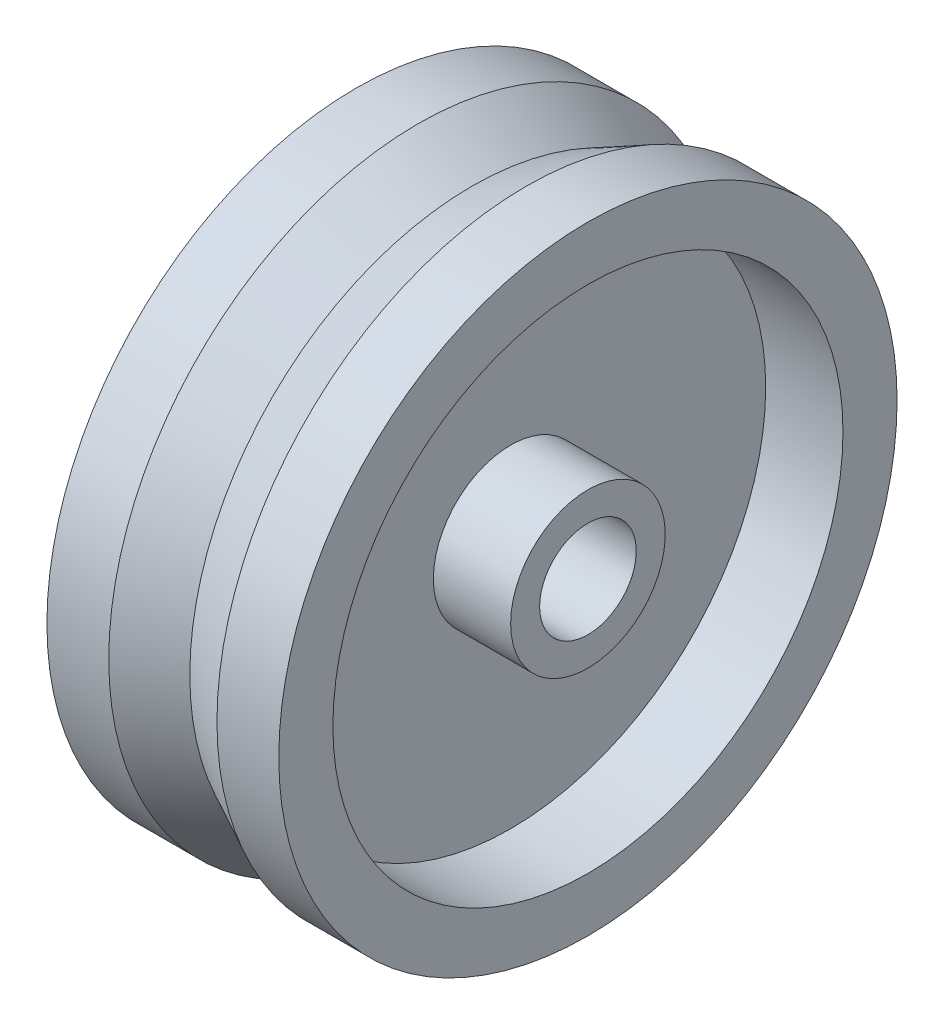
ISO-10303-21;
HEADER;
FILE_DESCRIPTION(('STEP AP214'),'2;1');
FILE_NAME('part.step','',(''),(''),'','','');
FILE_SCHEMA(('AUTOMOTIVE_DESIGN { 1 0 10303 214 1 1 1 1 }'));
ENDSEC;
DATA;
#1=APPLICATION_CONTEXT('core data for automotive mechanical design processes');
#2=APPLICATION_PROTOCOL_DEFINITION('international standard','automotive_design',2000,#1);
#3=PRODUCT_CONTEXT('',#1,'mechanical');
#4=PRODUCT('Part','Part','',(#3));
#5=PRODUCT_RELATED_PRODUCT_CATEGORY('part','',(#4));
#6=PRODUCT_DEFINITION_FORMATION('','',#4);
#7=PRODUCT_DEFINITION_CONTEXT('part definition',#1,'design');
#8=PRODUCT_DEFINITION('design','',#6,#7);
#9=PRODUCT_DEFINITION_SHAPE('','',#8);
#10=(LENGTH_UNIT() NAMED_UNIT(*) SI_UNIT(.MILLI.,.METRE.));
#11=(NAMED_UNIT(*) PLANE_ANGLE_UNIT() SI_UNIT($,.RADIAN.));
#12=(NAMED_UNIT(*) SI_UNIT($,.STERADIAN.) SOLID_ANGLE_UNIT());
#13=UNCERTAINTY_MEASURE_WITH_UNIT(LENGTH_MEASURE(1.E-05),#10,'distance_accuracy_value','');
#14=(GEOMETRIC_REPRESENTATION_CONTEXT(3) GLOBAL_UNCERTAINTY_ASSIGNED_CONTEXT((#13)) GLOBAL_UNIT_ASSIGNED_CONTEXT((#10,
#11,#12)) REPRESENTATION_CONTEXT('',''));
#15=CARTESIAN_POINT('',(0.,0.,0.));
#16=DIRECTION('',(0.,0.,1.));
#17=DIRECTION('',(1.,0.,0.));
#18=AXIS2_PLACEMENT_3D('',#15,#16,#17);
#19=CARTESIAN_POINT('',(-5.60858660204757,5.,0.));
#20=DIRECTION('',(1.,0.,0.));
#21=DIRECTION('',(0.,0.,-1.));
#22=AXIS2_PLACEMENT_3D('',#19,#20,#21);
#23=PLANE('',#22);
#24=CARTESIAN_POINT('',(-5.60858660204757,0.,0.));
#25=DIRECTION('',(-1.,0.,0.));
#26=DIRECTION('',(0.,0.,1.));
#27=AXIS2_PLACEMENT_3D('',#24,#25,#26);
#28=CIRCLE('',#27,3.125);
#29=CARTESIAN_POINT('',(-5.60858660204757,0.,3.125));
#30=VERTEX_POINT('',#29);
#31=EDGE_CURVE('E10',#30,#30,#28,.T.);
#32=ORIENTED_EDGE('',*,*,#31,.F.);
#33=EDGE_LOOP('',(#32));
#34=FACE_BOUND('',#33,.T.);
#35=CARTESIAN_POINT('',(-5.60858660204757,0.,0.));
#36=DIRECTION('',(-1.,0.,0.));
#37=DIRECTION('',(0.,0.,1.));
#38=AXIS2_PLACEMENT_3D('',#35,#36,#37);
#39=CIRCLE('',#38,5.);
#40=CARTESIAN_POINT('',(-5.60858660204757,0.,5.));
#41=VERTEX_POINT('',#40);
#42=EDGE_CURVE('E106',#41,#41,#39,.T.);
#43=ORIENTED_EDGE('',*,*,#42,.T.);
#44=EDGE_LOOP('',(#43));
#45=FACE_BOUND('',#44,.T.);
#46=ADVANCED_FACE('F43',(#34,#45),#23,.F.);
#47=CARTESIAN_POINT('',(-7.63862781954887,0.,0.));
#48=DIRECTION('',(-1.,0.,0.));
#49=DIRECTION('',(0.,0.,1.));
#50=AXIS2_PLACEMENT_3D('',#47,#48,#49);
#51=CYLINDRICAL_SURFACE('',#50,3.125);
#52=CARTESIAN_POINT('',(9.39141339795243,0.,0.));
#53=DIRECTION('',(-1.,0.,0.));
#54=DIRECTION('',(0.,0.,1.));
#55=AXIS2_PLACEMENT_3D('',#52,#53,#54);
#56=CIRCLE('',#55,3.125);
#57=CARTESIAN_POINT('',(9.39141339795243,0.,3.125));
#58=VERTEX_POINT('',#57);
#59=EDGE_CURVE('E50',#58,#58,#56,.T.);
#60=ORIENTED_EDGE('',*,*,#59,.F.);
#61=EDGE_LOOP('',(#60));
#62=FACE_BOUND('',#61,.T.);
#63=ORIENTED_EDGE('',*,*,#31,.T.);
#64=EDGE_LOOP('',(#63));
#65=FACE_BOUND('',#64,.T.);
#66=ADVANCED_FACE('F186',(#62,#65),#51,.F.);
#67=CARTESIAN_POINT('',(9.39141339795244,3.125,0.));
#68=DIRECTION('',(-1.,0.,0.));
#69=DIRECTION('',(0.,0.,1.));
#70=AXIS2_PLACEMENT_3D('',#67,#68,#69);
#71=PLANE('',#70);
#72=CARTESIAN_POINT('',(9.39141339795243,0.,0.));
#73=DIRECTION('',(-1.,0.,0.));
#74=DIRECTION('',(0.,0.,1.));
#75=AXIS2_PLACEMENT_3D('',#72,#73,#74);
#76=CIRCLE('',#75,5.);
#77=CARTESIAN_POINT('',(9.39141339795243,0.,5.));
#78=VERTEX_POINT('',#77);
#79=EDGE_CURVE('E55',#78,#78,#76,.T.);
#80=ORIENTED_EDGE('',*,*,#79,.F.);
#81=EDGE_LOOP('',(#80));
#82=FACE_BOUND('',#81,.T.);
#83=ORIENTED_EDGE('',*,*,#59,.T.);
#84=EDGE_LOOP('',(#83));
#85=FACE_BOUND('',#84,.T.);
#86=ADVANCED_FACE('F181',(#82,#85),#71,.F.);
#87=CARTESIAN_POINT('',(-7.63862781954887,0.,0.));
#88=DIRECTION('',(-1.,0.,0.));
#89=DIRECTION('',(0.,0.,1.));
#90=AXIS2_PLACEMENT_3D('',#87,#88,#89);
#91=CYLINDRICAL_SURFACE('',#90,5.);
#92=CARTESIAN_POINT('',(4.39141339795244,0.,0.));
#93=DIRECTION('',(-1.,0.,0.));
#94=DIRECTION('',(0.,0.,1.));
#95=AXIS2_PLACEMENT_3D('',#92,#93,#94);
#96=CIRCLE('',#95,5.);
#97=CARTESIAN_POINT('',(4.39141339795244,0.,5.));
#98=VERTEX_POINT('',#97);
#99=EDGE_CURVE('E60',#98,#98,#96,.T.);
#100=ORIENTED_EDGE('',*,*,#99,.F.);
#101=EDGE_LOOP('',(#100));
#102=FACE_BOUND('',#101,.T.);
#103=ORIENTED_EDGE('',*,*,#79,.T.);
#104=EDGE_LOOP('',(#103));
#105=FACE_BOUND('',#104,.T.);
#106=ADVANCED_FACE('F175',(#102,#105),#91,.T.);
#107=CARTESIAN_POINT('',(4.39141339795244,5.,0.));
#108=DIRECTION('',(-1.,0.,0.));
#109=DIRECTION('',(0.,0.,1.));
#110=AXIS2_PLACEMENT_3D('',#107,#108,#109);
#111=PLANE('',#110);
#112=CARTESIAN_POINT('',(4.39141339795244,0.,0.));
#113=DIRECTION('',(-1.,0.,0.));
#114=DIRECTION('',(0.,0.,1.));
#115=AXIS2_PLACEMENT_3D('',#112,#113,#114);
#116=CIRCLE('',#115,16.5);
#117=CARTESIAN_POINT('',(4.39141339795244,0.,16.5));
#118=VERTEX_POINT('',#117);
#119=EDGE_CURVE('E66',#118,#118,#116,.T.);
#120=ORIENTED_EDGE('',*,*,#119,.F.);
#121=EDGE_LOOP('',(#120));
#122=FACE_BOUND('',#121,.T.);
#123=ORIENTED_EDGE('',*,*,#99,.T.);
#124=EDGE_LOOP('',(#123));
#125=FACE_BOUND('',#124,.T.);
#126=ADVANCED_FACE('F169',(#122,#125),#111,.F.);
#127=CARTESIAN_POINT('',(-7.63862781954887,0.,0.));
#128=DIRECTION('',(-1.,0.,0.));
#129=DIRECTION('',(0.,0.,1.));
#130=AXIS2_PLACEMENT_3D('',#127,#128,#129);
#131=CYLINDRICAL_SURFACE('',#130,16.5);
#132=CARTESIAN_POINT('',(9.39141339795243,0.,0.));
#133=DIRECTION('',(-1.,0.,0.));
#134=DIRECTION('',(0.,0.,1.));
#135=AXIS2_PLACEMENT_3D('',#132,#133,#134);
#136=CIRCLE('',#135,16.5);
#137=CARTESIAN_POINT('',(9.39141339795243,0.,16.5));
#138=VERTEX_POINT('',#137);
#139=EDGE_CURVE('E70',#138,#138,#136,.T.);
#140=ORIENTED_EDGE('',*,*,#139,.F.);
#141=EDGE_LOOP('',(#140));
#142=FACE_BOUND('',#141,.T.);
#143=ORIENTED_EDGE('',*,*,#119,.T.);
#144=EDGE_LOOP('',(#143));
#145=FACE_BOUND('',#144,.T.);
#146=ADVANCED_FACE('F163',(#142,#145),#131,.F.);
#147=CARTESIAN_POINT('',(9.39141339795243,16.5,0.));
#148=DIRECTION('',(-1.,0.,0.));
#149=DIRECTION('',(0.,0.,1.));
#150=AXIS2_PLACEMENT_3D('',#147,#148,#149);
#151=PLANE('',#150);
#152=CARTESIAN_POINT('',(9.39141339795243,0.,0.));
#153=DIRECTION('',(-1.,0.,0.));
#154=DIRECTION('',(0.,0.,1.));
#155=AXIS2_PLACEMENT_3D('',#152,#153,#154);
#156=CIRCLE('',#155,20.);
#157=CARTESIAN_POINT('',(9.39141339795243,0.,20.));
#158=VERTEX_POINT('',#157);
#159=EDGE_CURVE('E74',#158,#158,#156,.T.);
#160=ORIENTED_EDGE('',*,*,#159,.F.);
#161=EDGE_LOOP('',(#160));
#162=FACE_BOUND('',#161,.T.);
#163=ORIENTED_EDGE('',*,*,#139,.T.);
#164=EDGE_LOOP('',(#163));
#165=FACE_BOUND('',#164,.T.);
#166=ADVANCED_FACE('F157',(#162,#165),#151,.F.);
#167=CARTESIAN_POINT('',(-7.63862781954887,0.,0.));
#168=DIRECTION('',(-1.,0.,0.));
#169=DIRECTION('',(0.,0.,1.));
#170=AXIS2_PLACEMENT_3D('',#167,#168,#169);
#171=CYLINDRICAL_SURFACE('',#170,20.);
#172=CARTESIAN_POINT('',(5.39141339795243,0.,0.));
#173=DIRECTION('',(-1.,0.,0.));
#174=DIRECTION('',(0.,0.,1.));
#175=AXIS2_PLACEMENT_3D('',#172,#173,#174);
#176=CIRCLE('',#175,20.);
#177=CARTESIAN_POINT('',(5.39141339795243,0.,20.));
#178=VERTEX_POINT('',#177);
#179=EDGE_CURVE('E78',#178,#178,#176,.T.);
#180=ORIENTED_EDGE('',*,*,#179,.F.);
#181=EDGE_LOOP('',(#180));
#182=FACE_BOUND('',#181,.T.);
#183=ORIENTED_EDGE('',*,*,#159,.T.);
#184=EDGE_LOOP('',(#183));
#185=FACE_BOUND('',#184,.T.);
#186=ADVANCED_FACE('F151',(#182,#185),#171,.T.);
#187=CARTESIAN_POINT('',(5.39141339795243,0.,0.));
#188=DIRECTION('',(1.,0.,0.));
#189=DIRECTION('',(0.,0.,-1.));
#190=AXIS2_PLACEMENT_3D('',#187,#188,#189);
#191=CONICAL_SURFACE('',#190,20.,0.462142719241437);
#192=CARTESIAN_POINT('',(1.89141339795243,0.,0.));
#193=DIRECTION('',(-1.,0.,0.));
#194=DIRECTION('',(0.,0.,1.));
#195=AXIS2_PLACEMENT_3D('',#192,#193,#194);
#196=CIRCLE('',#195,18.2565789473684);
#197=CARTESIAN_POINT('',(1.89141339795243,0.,18.2565789473684));
#198=VERTEX_POINT('',#197);
#199=EDGE_CURVE('E82',#198,#198,#196,.T.);
#200=ORIENTED_EDGE('',*,*,#199,.F.);
#201=EDGE_LOOP('',(#200));
#202=FACE_BOUND('',#201,.T.);
#203=ORIENTED_EDGE('',*,*,#179,.T.);
#204=EDGE_LOOP('',(#203));
#205=FACE_BOUND('',#204,.T.);
#206=ADVANCED_FACE('F145',(#202,#205),#191,.T.);
#207=CARTESIAN_POINT('',(1.89141339795243,0.,0.));
#208=DIRECTION('',(-1.,0.,0.));
#209=DIRECTION('',(0.,0.,1.));
#210=AXIS2_PLACEMENT_3D('',#207,#208,#209);
#211=CONICAL_SURFACE('',#210,18.2565789473684,0.462142719241435);
#212=CARTESIAN_POINT('',(-1.60858660204757,0.,0.));
#213=DIRECTION('',(-1.,0.,0.));
#214=DIRECTION('',(0.,0.,1.));
#215=AXIS2_PLACEMENT_3D('',#212,#213,#214);
#216=CIRCLE('',#215,20.);
#217=CARTESIAN_POINT('',(-1.60858660204757,0.,20.));
#218=VERTEX_POINT('',#217);
#219=EDGE_CURVE('E86',#218,#218,#216,.T.);
#220=ORIENTED_EDGE('',*,*,#219,.F.);
#221=EDGE_LOOP('',(#220));
#222=FACE_BOUND('',#221,.T.);
#223=ORIENTED_EDGE('',*,*,#199,.T.);
#224=EDGE_LOOP('',(#223));
#225=FACE_BOUND('',#224,.T.);
#226=ADVANCED_FACE('F139',(#222,#225),#211,.T.);
#227=CARTESIAN_POINT('',(-7.63862781954887,0.,0.));
#228=DIRECTION('',(-1.,0.,0.));
#229=DIRECTION('',(0.,0.,1.));
#230=AXIS2_PLACEMENT_3D('',#227,#228,#229);
#231=CYLINDRICAL_SURFACE('',#230,20.);
#232=CARTESIAN_POINT('',(-5.60858660204757,0.,0.));
#233=DIRECTION('',(-1.,0.,0.));
#234=DIRECTION('',(0.,0.,1.));
#235=AXIS2_PLACEMENT_3D('',#232,#233,#234);
#236=CIRCLE('',#235,20.);
#237=CARTESIAN_POINT('',(-5.60858660204757,0.,20.));
#238=VERTEX_POINT('',#237);
#239=EDGE_CURVE('E90',#238,#238,#236,.T.);
#240=ORIENTED_EDGE('',*,*,#239,.F.);
#241=EDGE_LOOP('',(#240));
#242=FACE_BOUND('',#241,.T.);
#243=ORIENTED_EDGE('',*,*,#219,.T.);
#244=EDGE_LOOP('',(#243));
#245=FACE_BOUND('',#244,.T.);
#246=ADVANCED_FACE('F133',(#242,#245),#231,.T.);
#247=CARTESIAN_POINT('',(-5.60858660204757,20.,0.));
#248=DIRECTION('',(1.,0.,0.));
#249=DIRECTION('',(0.,0.,-1.));
#250=AXIS2_PLACEMENT_3D('',#247,#248,#249);
#251=PLANE('',#250);
#252=CARTESIAN_POINT('',(-5.60858660204757,0.,0.));
#253=DIRECTION('',(-1.,0.,0.));
#254=DIRECTION('',(0.,0.,1.));
#255=AXIS2_PLACEMENT_3D('',#252,#253,#254);
#256=CIRCLE('',#255,16.5);
#257=CARTESIAN_POINT('',(-5.60858660204757,0.,16.5));
#258=VERTEX_POINT('',#257);
#259=EDGE_CURVE('E94',#258,#258,#256,.T.);
#260=ORIENTED_EDGE('',*,*,#259,.F.);
#261=EDGE_LOOP('',(#260));
#262=FACE_BOUND('',#261,.T.);
#263=ORIENTED_EDGE('',*,*,#239,.T.);
#264=EDGE_LOOP('',(#263));
#265=FACE_BOUND('',#264,.T.);
#266=ADVANCED_FACE('F127',(#262,#265),#251,.F.);
#267=CARTESIAN_POINT('',(-7.63862781954887,0.,0.));
#268=DIRECTION('',(-1.,0.,0.));
#269=DIRECTION('',(0.,0.,1.));
#270=AXIS2_PLACEMENT_3D('',#267,#268,#269);
#271=CYLINDRICAL_SURFACE('',#270,16.5);
#272=CARTESIAN_POINT('',(-0.608586602047566,0.,0.));
#273=DIRECTION('',(-1.,0.,0.));
#274=DIRECTION('',(0.,0.,1.));
#275=AXIS2_PLACEMENT_3D('',#272,#273,#274);
#276=CIRCLE('',#275,16.5);
#277=CARTESIAN_POINT('',(-0.608586602047566,0.,16.5));
#278=VERTEX_POINT('',#277);
#279=EDGE_CURVE('E98',#278,#278,#276,.T.);
#280=ORIENTED_EDGE('',*,*,#279,.F.);
#281=EDGE_LOOP('',(#280));
#282=FACE_BOUND('',#281,.T.);
#283=ORIENTED_EDGE('',*,*,#259,.T.);
#284=EDGE_LOOP('',(#283));
#285=FACE_BOUND('',#284,.T.);
#286=ADVANCED_FACE('F121',(#282,#285),#271,.F.);
#287=CARTESIAN_POINT('',(-0.608586602047565,16.5,0.));
#288=DIRECTION('',(1.,0.,0.));
#289=DIRECTION('',(0.,0.,-1.));
#290=AXIS2_PLACEMENT_3D('',#287,#288,#289);
#291=PLANE('',#290);
#292=CARTESIAN_POINT('',(-0.608586602047564,0.,0.));
#293=DIRECTION('',(-1.,0.,0.));
#294=DIRECTION('',(0.,0.,1.));
#295=AXIS2_PLACEMENT_3D('',#292,#293,#294);
#296=CIRCLE('',#295,5.);
#297=CARTESIAN_POINT('',(-0.608586602047564,0.,5.));
#298=VERTEX_POINT('',#297);
#299=EDGE_CURVE('E102',#298,#298,#296,.T.);
#300=ORIENTED_EDGE('',*,*,#299,.F.);
#301=EDGE_LOOP('',(#300));
#302=FACE_BOUND('',#301,.T.);
#303=ORIENTED_EDGE('',*,*,#279,.T.);
#304=EDGE_LOOP('',(#303));
#305=FACE_BOUND('',#304,.T.);
#306=ADVANCED_FACE('F115',(#302,#305),#291,.F.);
#307=CARTESIAN_POINT('',(-7.63862781954887,0.,0.));
#308=DIRECTION('',(-1.,0.,0.));
#309=DIRECTION('',(0.,0.,1.));
#310=AXIS2_PLACEMENT_3D('',#307,#308,#309);
#311=CYLINDRICAL_SURFACE('',#310,5.);
#312=ORIENTED_EDGE('',*,*,#42,.F.);
#313=EDGE_LOOP('',(#312));
#314=FACE_BOUND('',#313,.T.);
#315=ORIENTED_EDGE('',*,*,#299,.T.);
#316=EDGE_LOOP('',(#315));
#317=FACE_BOUND('',#316,.T.);
#318=ADVANCED_FACE('F112',(#314,#317),#311,.T.);
#319=CLOSED_SHELL('',(#46,#66,#86,#106,#126,#146,#166,#186,#206,#226,#246,#266,#286,#306,#318));
#320=MANIFOLD_SOLID_BREP('B2',#319);
#321=ADVANCED_BREP_SHAPE_REPRESENTATION('',(#18,#320),#14);
#322=SHAPE_DEFINITION_REPRESENTATION(#9,#321);
ENDSEC;
END-ISO-10303-21;
